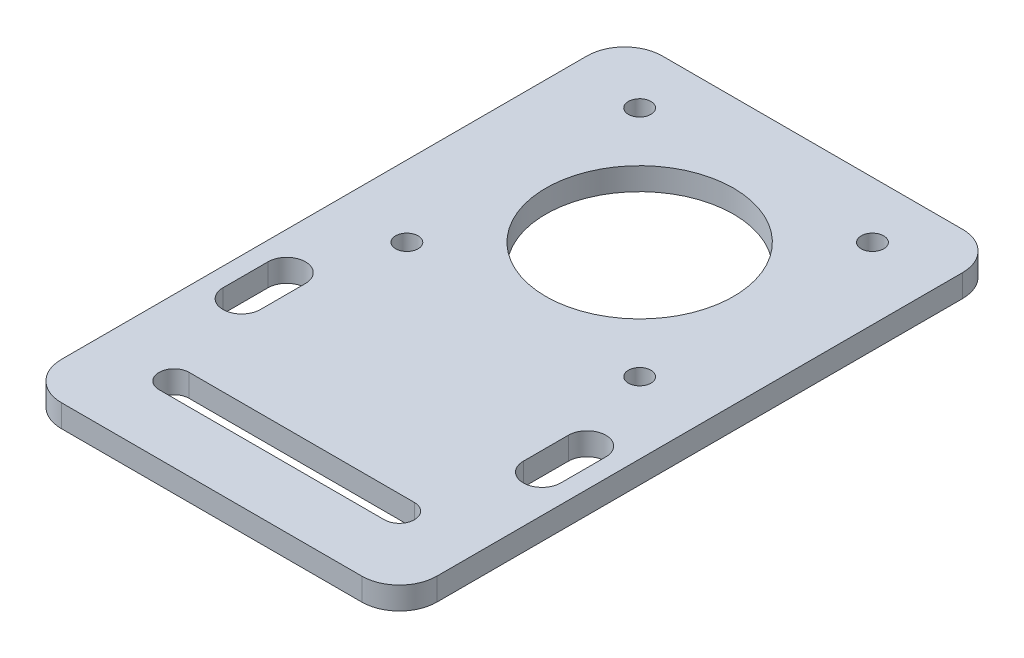
ISO-10303-21;
HEADER;
FILE_DESCRIPTION(('STEP AP214'),'2;1');
FILE_NAME('part.step','',(''),(''),'','','');
FILE_SCHEMA(('AUTOMOTIVE_DESIGN { 1 0 10303 214 1 1 1 1 }'));
ENDSEC;
DATA;
#1=APPLICATION_CONTEXT('core data for automotive mechanical design processes');
#2=APPLICATION_PROTOCOL_DEFINITION('international standard','automotive_design',2000,#1);
#3=PRODUCT_CONTEXT('',#1,'mechanical');
#4=PRODUCT('Part','Part','',(#3));
#5=PRODUCT_RELATED_PRODUCT_CATEGORY('part','',(#4));
#6=PRODUCT_DEFINITION_FORMATION('','',#4);
#7=PRODUCT_DEFINITION_CONTEXT('part definition',#1,'design');
#8=PRODUCT_DEFINITION('design','',#6,#7);
#9=PRODUCT_DEFINITION_SHAPE('','',#8);
#10=(LENGTH_UNIT() NAMED_UNIT(*) SI_UNIT(.MILLI.,.METRE.));
#11=(NAMED_UNIT(*) PLANE_ANGLE_UNIT() SI_UNIT($,.RADIAN.));
#12=(NAMED_UNIT(*) SI_UNIT($,.STERADIAN.) SOLID_ANGLE_UNIT());
#13=UNCERTAINTY_MEASURE_WITH_UNIT(LENGTH_MEASURE(1.E-05),#10,'distance_accuracy_value','');
#14=(GEOMETRIC_REPRESENTATION_CONTEXT(3) GLOBAL_UNCERTAINTY_ASSIGNED_CONTEXT((#13)) GLOBAL_UNIT_ASSIGNED_CONTEXT((#10,
#11,#12)) REPRESENTATION_CONTEXT('',''));
#15=CARTESIAN_POINT('',(0.,0.,0.));
#16=DIRECTION('',(0.,0.,1.));
#17=DIRECTION('',(1.,0.,0.));
#18=AXIS2_PLACEMENT_3D('',#15,#16,#17);
#19=CARTESIAN_POINT('',(-25.,3.,-40.));
#20=DIRECTION('',(1.,0.,0.));
#21=DIRECTION('',(0.,0.,-1.));
#22=AXIS2_PLACEMENT_3D('',#19,#20,#21);
#23=PLANE('',#22);
#24=DIRECTION('',(0.,0.,1.));
#25=VECTOR('',#24,1.);
#26=CARTESIAN_POINT('',(-25.,0.,-40.));
#27=LINE('',#26,#25);
#28=CARTESIAN_POINT('',(-25.,0.,-35.));
#29=VERTEX_POINT('',#28);
#30=CARTESIAN_POINT('',(-25.,0.,35.));
#31=VERTEX_POINT('',#30);
#32=EDGE_CURVE('E265',#29,#31,#27,.T.);
#33=ORIENTED_EDGE('',*,*,#32,.T.);
#34=DIRECTION('',(0.,-1.,0.));
#35=VECTOR('',#34,1.);
#36=CARTESIAN_POINT('',(-25.,3.,35.));
#37=LINE('',#36,#35);
#38=CARTESIAN_POINT('',(-25.,3.,35.));
#39=VERTEX_POINT('',#38);
#40=EDGE_CURVE('E352',#31,#39,#37,.F.);
#41=ORIENTED_EDGE('',*,*,#40,.T.);
#42=DIRECTION('',(0.,0.,1.));
#43=VECTOR('',#42,1.);
#44=CARTESIAN_POINT('',(-25.,3.,-40.));
#45=LINE('',#44,#43);
#46=CARTESIAN_POINT('',(-25.,3.,-35.));
#47=VERTEX_POINT('',#46);
#48=EDGE_CURVE('E300',#47,#39,#45,.T.);
#49=ORIENTED_EDGE('',*,*,#48,.F.);
#50=DIRECTION('',(0.,-1.,0.));
#51=VECTOR('',#50,1.);
#52=CARTESIAN_POINT('',(-25.,3.,-35.));
#53=LINE('',#52,#51);
#54=EDGE_CURVE('E349',#47,#29,#53,.T.);
#55=ORIENTED_EDGE('',*,*,#54,.T.);
#56=EDGE_LOOP('',(#33,#41,#49,#55));
#57=FACE_BOUND('',#56,.T.);
#58=ADVANCED_FACE('F32',(#57),#23,.F.);
#59=CARTESIAN_POINT('',(25.,3.,40.));
#60=DIRECTION('',(0.,0.,-1.));
#61=DIRECTION('',(-1.,0.,0.));
#62=AXIS2_PLACEMENT_3D('',#59,#60,#61);
#63=PLANE('',#62);
#64=DIRECTION('',(1.,0.,0.));
#65=VECTOR('',#64,1.);
#66=CARTESIAN_POINT('',(25.,0.,40.));
#67=LINE('',#66,#65);
#68=CARTESIAN_POINT('',(-20.,0.,40.));
#69=VERTEX_POINT('',#68);
#70=CARTESIAN_POINT('',(20.,0.,40.));
#71=VERTEX_POINT('',#70);
#72=EDGE_CURVE('E316',#69,#71,#67,.T.);
#73=ORIENTED_EDGE('',*,*,#72,.T.);
#74=DIRECTION('',(0.,-1.,0.));
#75=VECTOR('',#74,1.);
#76=CARTESIAN_POINT('',(20.,3.,40.));
#77=LINE('',#76,#75);
#78=CARTESIAN_POINT('',(20.,3.,40.));
#79=VERTEX_POINT('',#78);
#80=EDGE_CURVE('E339',#71,#79,#77,.F.);
#81=ORIENTED_EDGE('',*,*,#80,.T.);
#82=DIRECTION('',(1.,0.,0.));
#83=VECTOR('',#82,1.);
#84=CARTESIAN_POINT('',(25.,3.,40.));
#85=LINE('',#84,#83);
#86=CARTESIAN_POINT('',(-20.,3.,40.));
#87=VERTEX_POINT('',#86);
#88=EDGE_CURVE('E303',#87,#79,#85,.T.);
#89=ORIENTED_EDGE('',*,*,#88,.F.);
#90=DIRECTION('',(0.,-1.,0.));
#91=VECTOR('',#90,1.);
#92=CARTESIAN_POINT('',(-20.,3.,40.));
#93=LINE('',#92,#91);
#94=EDGE_CURVE('E336',#87,#69,#93,.T.);
#95=ORIENTED_EDGE('',*,*,#94,.T.);
#96=EDGE_LOOP('',(#73,#81,#89,#95));
#97=FACE_BOUND('',#96,.T.);
#98=ADVANCED_FACE('F381',(#97),#63,.F.);
#99=CARTESIAN_POINT('',(25.,3.,-40.));
#100=DIRECTION('',(-1.,0.,0.));
#101=DIRECTION('',(0.,0.,1.));
#102=AXIS2_PLACEMENT_3D('',#99,#100,#101);
#103=PLANE('',#102);
#104=DIRECTION('',(0.,0.,-1.));
#105=VECTOR('',#104,1.);
#106=CARTESIAN_POINT('',(25.,3.,-40.));
#107=LINE('',#106,#105);
#108=CARTESIAN_POINT('',(25.,3.,35.));
#109=VERTEX_POINT('',#108);
#110=CARTESIAN_POINT('',(25.,3.,-35.));
#111=VERTEX_POINT('',#110);
#112=EDGE_CURVE('E307',#109,#111,#107,.T.);
#113=ORIENTED_EDGE('',*,*,#112,.F.);
#114=DIRECTION('',(0.,-1.,0.));
#115=VECTOR('',#114,1.);
#116=CARTESIAN_POINT('',(25.,3.,35.));
#117=LINE('',#116,#115);
#118=CARTESIAN_POINT('',(25.,0.,35.));
#119=VERTEX_POINT('',#118);
#120=EDGE_CURVE('E325',#109,#119,#117,.T.);
#121=ORIENTED_EDGE('',*,*,#120,.T.);
#122=DIRECTION('',(0.,0.,-1.));
#123=VECTOR('',#122,1.);
#124=CARTESIAN_POINT('',(25.,0.,-40.));
#125=LINE('',#124,#123);
#126=CARTESIAN_POINT('',(25.,0.,-35.));
#127=VERTEX_POINT('',#126);
#128=EDGE_CURVE('E319',#119,#127,#125,.T.);
#129=ORIENTED_EDGE('',*,*,#128,.T.);
#130=DIRECTION('',(0.,-1.,0.));
#131=VECTOR('',#130,1.);
#132=CARTESIAN_POINT('',(25.,3.,-35.));
#133=LINE('',#132,#131);
#134=EDGE_CURVE('E313',#127,#111,#133,.F.);
#135=ORIENTED_EDGE('',*,*,#134,.T.);
#136=EDGE_LOOP('',(#113,#121,#129,#135));
#137=FACE_BOUND('',#136,.T.);
#138=ADVANCED_FACE('F389',(#137),#103,.F.);
#139=CARTESIAN_POINT('',(25.,3.,-40.));
#140=DIRECTION('',(0.,0.,1.));
#141=DIRECTION('',(1.,0.,0.));
#142=AXIS2_PLACEMENT_3D('',#139,#140,#141);
#143=PLANE('',#142);
#144=DIRECTION('',(-1.,0.,0.));
#145=VECTOR('',#144,1.);
#146=CARTESIAN_POINT('',(25.,0.,-40.));
#147=LINE('',#146,#145);
#148=CARTESIAN_POINT('',(20.,0.,-40.));
#149=VERTEX_POINT('',#148);
#150=CARTESIAN_POINT('',(-20.,0.,-40.));
#151=VERTEX_POINT('',#150);
#152=EDGE_CURVE('E304',#149,#151,#147,.T.);
#153=ORIENTED_EDGE('',*,*,#152,.T.);
#154=DIRECTION('',(0.,-1.,0.));
#155=VECTOR('',#154,1.);
#156=CARTESIAN_POINT('',(-20.,3.,-40.));
#157=LINE('',#156,#155);
#158=CARTESIAN_POINT('',(-20.,3.,-40.));
#159=VERTEX_POINT('',#158);
#160=EDGE_CURVE('E11',#151,#159,#157,.F.);
#161=ORIENTED_EDGE('',*,*,#160,.T.);
#162=DIRECTION('',(-1.,0.,0.));
#163=VECTOR('',#162,1.);
#164=CARTESIAN_POINT('',(25.,3.,-40.));
#165=LINE('',#164,#163);
#166=CARTESIAN_POINT('',(20.,3.,-40.));
#167=VERTEX_POINT('',#166);
#168=EDGE_CURVE('E310',#167,#159,#165,.T.);
#169=ORIENTED_EDGE('',*,*,#168,.F.);
#170=DIRECTION('',(0.,-1.,0.));
#171=VECTOR('',#170,1.);
#172=CARTESIAN_POINT('',(20.,3.,-40.));
#173=LINE('',#172,#171);
#174=EDGE_CURVE('E40',#167,#149,#173,.T.);
#175=ORIENTED_EDGE('',*,*,#174,.T.);
#176=EDGE_LOOP('',(#153,#161,#169,#175));
#177=FACE_BOUND('',#176,.T.);
#178=ADVANCED_FACE('F358',(#177),#143,.F.);
#179=CARTESIAN_POINT('',(0.,3.,0.));
#180=DIRECTION('',(0.,-1.,0.));
#181=DIRECTION('',(0.,0.,-1.));
#182=AXIS2_PLACEMENT_3D('',#179,#180,#181);
#183=PLANE('',#182);
#184=DIRECTION('',(0.,0.,1.));
#185=VECTOR('',#184,1.);
#186=CARTESIAN_POINT('',(17.4999999999999,3.,10.));
#187=LINE('',#186,#185);
#188=CARTESIAN_POINT('',(17.4999999999999,3.,10.));
#189=VERTEX_POINT('',#188);
#190=CARTESIAN_POINT('',(17.4999999999999,3.,16.));
#191=VERTEX_POINT('',#190);
#192=EDGE_CURVE('E198',#189,#191,#187,.T.);
#193=ORIENTED_EDGE('',*,*,#192,.F.);
#194=CARTESIAN_POINT('',(20.,3.,10.));
#195=DIRECTION('',(0.,1.,0.));
#196=DIRECTION('',(0.,0.,1.));
#197=AXIS2_PLACEMENT_3D('',#194,#195,#196);
#198=CIRCLE('',#197,2.50000000000007);
#199=CARTESIAN_POINT('',(22.5,3.,10.));
#200=VERTEX_POINT('',#199);
#201=EDGE_CURVE('E47',#200,#189,#198,.T.);
#202=ORIENTED_EDGE('',*,*,#201,.F.);
#203=DIRECTION('',(0.,0.,-1.));
#204=VECTOR('',#203,1.);
#205=CARTESIAN_POINT('',(22.5,3.,10.));
#206=LINE('',#205,#204);
#207=CARTESIAN_POINT('',(22.5,3.,16.));
#208=VERTEX_POINT('',#207);
#209=EDGE_CURVE('E189',#208,#200,#206,.T.);
#210=ORIENTED_EDGE('',*,*,#209,.F.);
#211=CARTESIAN_POINT('',(20.,3.,16.));
#212=DIRECTION('',(0.,1.,0.));
#213=DIRECTION('',(0.,0.,1.));
#214=AXIS2_PLACEMENT_3D('',#211,#212,#213);
#215=CIRCLE('',#214,2.50000000000007);
#216=EDGE_CURVE('E192',#191,#208,#215,.T.);
#217=ORIENTED_EDGE('',*,*,#216,.F.);
#218=EDGE_LOOP('',(#193,#202,#210,#217));
#219=FACE_BOUND('',#218,.T.);
#220=DIRECTION('',(0.,0.,1.));
#221=VECTOR('',#220,1.);
#222=CARTESIAN_POINT('',(-22.5,3.,10.0000000000002));
#223=LINE('',#222,#221);
#224=CARTESIAN_POINT('',(-22.5,3.,10.0000000000002));
#225=VERTEX_POINT('',#224);
#226=CARTESIAN_POINT('',(-22.4999999999999,3.,16.0000000000002));
#227=VERTEX_POINT('',#226);
#228=EDGE_CURVE('E224',#225,#227,#223,.T.);
#229=ORIENTED_EDGE('',*,*,#228,.F.);
#230=CARTESIAN_POINT('',(-19.9999999999999,3.,10.0000000000002));
#231=DIRECTION('',(0.,1.,0.));
#232=DIRECTION('',(0.,0.,-1.));
#233=AXIS2_PLACEMENT_3D('',#230,#231,#232);
#234=CIRCLE('',#233,2.50000000000007);
#235=CARTESIAN_POINT('',(-17.4999999999998,3.,10.0000000000002));
#236=VERTEX_POINT('',#235);
#237=EDGE_CURVE('E55',#236,#225,#234,.T.);
#238=ORIENTED_EDGE('',*,*,#237,.F.);
#239=DIRECTION('',(0.,0.,-1.));
#240=VECTOR('',#239,1.);
#241=CARTESIAN_POINT('',(-17.4999999999998,3.,10.0000000000002));
#242=LINE('',#241,#240);
#243=CARTESIAN_POINT('',(-17.4999999999998,3.,16.0000000000002));
#244=VERTEX_POINT('',#243);
#245=EDGE_CURVE('E213',#244,#236,#242,.T.);
#246=ORIENTED_EDGE('',*,*,#245,.F.);
#247=CARTESIAN_POINT('',(-19.9999999999999,3.,16.0000000000002));
#248=DIRECTION('',(0.,1.,0.));
#249=DIRECTION('',(0.,0.,-1.));
#250=AXIS2_PLACEMENT_3D('',#247,#248,#249);
#251=CIRCLE('',#250,2.50000000000007);
#252=EDGE_CURVE('E227',#227,#244,#251,.T.);
#253=ORIENTED_EDGE('',*,*,#252,.F.);
#254=EDGE_LOOP('',(#229,#238,#246,#253));
#255=FACE_BOUND('',#254,.T.);
#256=DIRECTION('',(1.,0.,0.));
#257=VECTOR('',#256,1.);
#258=CARTESIAN_POINT('',(-15.0000000000099,3.,32.));
#259=LINE('',#258,#257);
#260=CARTESIAN_POINT('',(-15.0000000000099,3.,32.));
#261=VERTEX_POINT('',#260);
#262=CARTESIAN_POINT('',(15.0000000000099,3.,32.));
#263=VERTEX_POINT('',#262);
#264=EDGE_CURVE('E254',#261,#263,#259,.T.);
#265=ORIENTED_EDGE('',*,*,#264,.F.);
#266=CARTESIAN_POINT('',(-15.0000000000099,3.,30.));
#267=DIRECTION('',(0.,1.,0.));
#268=DIRECTION('',(0.,0.,1.));
#269=AXIS2_PLACEMENT_3D('',#266,#267,#268);
#270=CIRCLE('',#269,2.);
#271=CARTESIAN_POINT('',(-15.0000000000099,3.,28.));
#272=VERTEX_POINT('',#271);
#273=EDGE_CURVE('E252',#272,#261,#270,.T.);
#274=ORIENTED_EDGE('',*,*,#273,.F.);
#275=DIRECTION('',(-1.,0.,0.));
#276=VECTOR('',#275,1.);
#277=CARTESIAN_POINT('',(-15.0000000000099,3.,28.));
#278=LINE('',#277,#276);
#279=CARTESIAN_POINT('',(15.,3.,28.));
#280=VERTEX_POINT('',#279);
#281=EDGE_CURVE('E242',#280,#272,#278,.T.);
#282=ORIENTED_EDGE('',*,*,#281,.F.);
#283=CARTESIAN_POINT('',(15.0000000000099,3.,30.));
#284=DIRECTION('',(0.,1.,0.));
#285=DIRECTION('',(0.,0.,1.));
#286=AXIS2_PLACEMENT_3D('',#283,#284,#285);
#287=CIRCLE('',#286,2.00000000000001);
#288=EDGE_CURVE('E258',#263,#280,#287,.T.);
#289=ORIENTED_EDGE('',*,*,#288,.F.);
#290=EDGE_LOOP('',(#265,#274,#282,#289));
#291=FACE_BOUND('',#290,.T.);
#292=CARTESIAN_POINT('',(0.,3.,-17.));
#293=DIRECTION('',(0.,1.,0.));
#294=DIRECTION('',(0.,0.,1.));
#295=AXIS2_PLACEMENT_3D('',#292,#293,#294);
#296=CIRCLE('',#295,12.5);
#297=CARTESIAN_POINT('',(0.,3.,-4.5));
#298=VERTEX_POINT('',#297);
#299=EDGE_CURVE('E205',#298,#298,#296,.T.);
#300=ORIENTED_EDGE('',*,*,#299,.F.);
#301=EDGE_LOOP('',(#300));
#302=FACE_BOUND('',#301,.T.);
#303=CARTESIAN_POINT('',(15.5,3.,-1.5));
#304=DIRECTION('',(0.,1.,0.));
#305=DIRECTION('',(0.,0.,1.));
#306=AXIS2_PLACEMENT_3D('',#303,#304,#305);
#307=CIRCLE('',#306,1.5);
#308=CARTESIAN_POINT('',(15.5,3.,0.));
#309=VERTEX_POINT('',#308);
#310=EDGE_CURVE('E275',#309,#309,#307,.T.);
#311=ORIENTED_EDGE('',*,*,#310,.F.);
#312=EDGE_LOOP('',(#311));
#313=FACE_BOUND('',#312,.T.);
#314=CARTESIAN_POINT('',(15.5,3.,-32.5));
#315=DIRECTION('',(0.,1.,0.));
#316=DIRECTION('',(0.,0.,1.));
#317=AXIS2_PLACEMENT_3D('',#314,#315,#316);
#318=CIRCLE('',#317,1.5);
#319=CARTESIAN_POINT('',(15.5,3.,-31.));
#320=VERTEX_POINT('',#319);
#321=EDGE_CURVE('E292',#320,#320,#318,.T.);
#322=ORIENTED_EDGE('',*,*,#321,.F.);
#323=EDGE_LOOP('',(#322));
#324=FACE_BOUND('',#323,.T.);
#325=CARTESIAN_POINT('',(-15.5,3.,-1.5));
#326=DIRECTION('',(0.,1.,0.));
#327=DIRECTION('',(0.,0.,1.));
#328=AXIS2_PLACEMENT_3D('',#325,#326,#327);
#329=CIRCLE('',#328,1.5);
#330=CARTESIAN_POINT('',(-15.5,3.,0.));
#331=VERTEX_POINT('',#330);
#332=EDGE_CURVE('E286',#331,#331,#329,.T.);
#333=ORIENTED_EDGE('',*,*,#332,.F.);
#334=EDGE_LOOP('',(#333));
#335=FACE_BOUND('',#334,.T.);
#336=CARTESIAN_POINT('',(-15.5,3.,-32.5));
#337=DIRECTION('',(0.,1.,0.));
#338=DIRECTION('',(0.,0.,1.));
#339=AXIS2_PLACEMENT_3D('',#336,#337,#338);
#340=CIRCLE('',#339,1.5);
#341=CARTESIAN_POINT('',(-15.5,3.,-31.));
#342=VERTEX_POINT('',#341);
#343=EDGE_CURVE('E280',#342,#342,#340,.T.);
#344=ORIENTED_EDGE('',*,*,#343,.F.);
#345=EDGE_LOOP('',(#344));
#346=FACE_BOUND('',#345,.T.);
#347=ORIENTED_EDGE('',*,*,#88,.T.);
#348=CARTESIAN_POINT('',(20.,3.,35.));
#349=DIRECTION('',(0.,-1.,0.));
#350=DIRECTION('',(0.,0.,-1.));
#351=AXIS2_PLACEMENT_3D('',#348,#349,#350);
#352=CIRCLE('',#351,5.);
#353=EDGE_CURVE('E347',#79,#109,#352,.F.);
#354=ORIENTED_EDGE('',*,*,#353,.T.);
#355=ORIENTED_EDGE('',*,*,#112,.T.);
#356=CARTESIAN_POINT('',(20.,3.,-35.));
#357=DIRECTION('',(0.,-1.,0.));
#358=DIRECTION('',(0.,0.,-1.));
#359=AXIS2_PLACEMENT_3D('',#356,#357,#358);
#360=CIRCLE('',#359,5.);
#361=EDGE_CURVE('E341',#111,#167,#360,.F.);
#362=ORIENTED_EDGE('',*,*,#361,.T.);
#363=ORIENTED_EDGE('',*,*,#168,.T.);
#364=CARTESIAN_POINT('',(-20.,3.,-35.));
#365=DIRECTION('',(0.,-1.,0.));
#366=DIRECTION('',(0.,0.,-1.));
#367=AXIS2_PLACEMENT_3D('',#364,#365,#366);
#368=CIRCLE('',#367,5.);
#369=EDGE_CURVE('E343',#159,#47,#368,.F.);
#370=ORIENTED_EDGE('',*,*,#369,.T.);
#371=ORIENTED_EDGE('',*,*,#48,.T.);
#372=CARTESIAN_POINT('',(-20.,3.,35.));
#373=DIRECTION('',(0.,-1.,0.));
#374=DIRECTION('',(0.,0.,-1.));
#375=AXIS2_PLACEMENT_3D('',#372,#373,#374);
#376=CIRCLE('',#375,5.);
#377=EDGE_CURVE('E345',#39,#87,#376,.F.);
#378=ORIENTED_EDGE('',*,*,#377,.T.);
#379=EDGE_LOOP('',(#347,#354,#355,#362,#363,#370,#371,#378));
#380=FACE_BOUND('',#379,.T.);
#381=ADVANCED_FACE('F374',(#219,#255,#291,#302,#313,#324,#335,#346,#380),#183,.F.);
#382=CARTESIAN_POINT('',(0.,0.,0.));
#383=DIRECTION('',(0.,-1.,0.));
#384=DIRECTION('',(0.,0.,-1.));
#385=AXIS2_PLACEMENT_3D('',#382,#383,#384);
#386=PLANE('',#385);
#387=CARTESIAN_POINT('',(20.,0.,10.));
#388=DIRECTION('',(0.,1.,0.));
#389=DIRECTION('',(0.,0.,1.));
#390=AXIS2_PLACEMENT_3D('',#387,#388,#389);
#391=CIRCLE('',#390,2.50000000000007);
#392=CARTESIAN_POINT('',(22.5,0.,10.));
#393=VERTEX_POINT('',#392);
#394=CARTESIAN_POINT('',(17.4999999999999,0.,10.));
#395=VERTEX_POINT('',#394);
#396=EDGE_CURVE('E170',#393,#395,#391,.T.);
#397=ORIENTED_EDGE('',*,*,#396,.T.);
#398=DIRECTION('',(0.,0.,1.));
#399=VECTOR('',#398,1.);
#400=CARTESIAN_POINT('',(17.4999999999999,0.,10.));
#401=LINE('',#400,#399);
#402=CARTESIAN_POINT('',(17.4999999999999,0.,16.));
#403=VERTEX_POINT('',#402);
#404=EDGE_CURVE('E180',#395,#403,#401,.T.);
#405=ORIENTED_EDGE('',*,*,#404,.T.);
#406=CARTESIAN_POINT('',(20.,0.,16.));
#407=DIRECTION('',(0.,1.,0.));
#408=DIRECTION('',(0.,0.,1.));
#409=AXIS2_PLACEMENT_3D('',#406,#407,#408);
#410=CIRCLE('',#409,2.50000000000007);
#411=CARTESIAN_POINT('',(22.5,0.,16.));
#412=VERTEX_POINT('',#411);
#413=EDGE_CURVE('E184',#403,#412,#410,.T.);
#414=ORIENTED_EDGE('',*,*,#413,.T.);
#415=DIRECTION('',(0.,0.,-1.));
#416=VECTOR('',#415,1.);
#417=CARTESIAN_POINT('',(22.5,0.,10.));
#418=LINE('',#417,#416);
#419=EDGE_CURVE('E176',#412,#393,#418,.T.);
#420=ORIENTED_EDGE('',*,*,#419,.T.);
#421=EDGE_LOOP('',(#397,#405,#414,#420));
#422=FACE_BOUND('',#421,.T.);
#423=CARTESIAN_POINT('',(-19.9999999999999,0.,10.0000000000002));
#424=DIRECTION('',(0.,1.,0.));
#425=DIRECTION('',(0.,0.,-1.));
#426=AXIS2_PLACEMENT_3D('',#423,#424,#425);
#427=CIRCLE('',#426,2.50000000000007);
#428=CARTESIAN_POINT('',(-17.4999999999998,0.,10.0000000000002));
#429=VERTEX_POINT('',#428);
#430=CARTESIAN_POINT('',(-22.5,0.,10.0000000000002));
#431=VERTEX_POINT('',#430);
#432=EDGE_CURVE('E209',#429,#431,#427,.T.);
#433=ORIENTED_EDGE('',*,*,#432,.T.);
#434=DIRECTION('',(0.,0.,1.));
#435=VECTOR('',#434,1.);
#436=CARTESIAN_POINT('',(-22.5,0.,10.0000000000002));
#437=LINE('',#436,#435);
#438=CARTESIAN_POINT('',(-22.4999999999999,0.,16.0000000000002));
#439=VERTEX_POINT('',#438);
#440=EDGE_CURVE('E212',#431,#439,#437,.T.);
#441=ORIENTED_EDGE('',*,*,#440,.T.);
#442=CARTESIAN_POINT('',(-19.9999999999999,0.,16.0000000000002));
#443=DIRECTION('',(0.,1.,0.));
#444=DIRECTION('',(0.,0.,-1.));
#445=AXIS2_PLACEMENT_3D('',#442,#443,#444);
#446=CIRCLE('',#445,2.50000000000007);
#447=CARTESIAN_POINT('',(-17.4999999999998,0.,16.0000000000002));
#448=VERTEX_POINT('',#447);
#449=EDGE_CURVE('E216',#439,#448,#446,.T.);
#450=ORIENTED_EDGE('',*,*,#449,.T.);
#451=DIRECTION('',(0.,0.,-1.));
#452=VECTOR('',#451,1.);
#453=CARTESIAN_POINT('',(-17.4999999999998,0.,10.0000000000002));
#454=LINE('',#453,#452);
#455=EDGE_CURVE('E219',#448,#429,#454,.T.);
#456=ORIENTED_EDGE('',*,*,#455,.T.);
#457=EDGE_LOOP('',(#433,#441,#450,#456));
#458=FACE_BOUND('',#457,.T.);
#459=CARTESIAN_POINT('',(-15.0000000000099,0.,30.));
#460=DIRECTION('',(0.,1.,0.));
#461=DIRECTION('',(0.,0.,1.));
#462=AXIS2_PLACEMENT_3D('',#459,#460,#461);
#463=CIRCLE('',#462,2.);
#464=CARTESIAN_POINT('',(-15.0000000000099,0.,28.));
#465=VERTEX_POINT('',#464);
#466=CARTESIAN_POINT('',(-15.0000000000099,0.,32.));
#467=VERTEX_POINT('',#466);
#468=EDGE_CURVE('E238',#465,#467,#463,.T.);
#469=ORIENTED_EDGE('',*,*,#468,.T.);
#470=DIRECTION('',(1.,0.,0.));
#471=VECTOR('',#470,1.);
#472=CARTESIAN_POINT('',(-15.0000000000099,0.,32.));
#473=LINE('',#472,#471);
#474=CARTESIAN_POINT('',(15.0000000000099,0.,32.));
#475=VERTEX_POINT('',#474);
#476=EDGE_CURVE('E241',#467,#475,#473,.T.);
#477=ORIENTED_EDGE('',*,*,#476,.T.);
#478=CARTESIAN_POINT('',(15.0000000000099,0.,30.));
#479=DIRECTION('',(0.,1.,0.));
#480=DIRECTION('',(0.,0.,1.));
#481=AXIS2_PLACEMENT_3D('',#478,#479,#480);
#482=CIRCLE('',#481,2.00000000000001);
#483=CARTESIAN_POINT('',(15.,0.,28.));
#484=VERTEX_POINT('',#483);
#485=EDGE_CURVE('E245',#475,#484,#482,.T.);
#486=ORIENTED_EDGE('',*,*,#485,.T.);
#487=DIRECTION('',(-1.,0.,0.));
#488=VECTOR('',#487,1.);
#489=CARTESIAN_POINT('',(-15.0000000000099,0.,28.));
#490=LINE('',#489,#488);
#491=EDGE_CURVE('E248',#484,#465,#490,.T.);
#492=ORIENTED_EDGE('',*,*,#491,.T.);
#493=EDGE_LOOP('',(#469,#477,#486,#492));
#494=FACE_BOUND('',#493,.T.);
#495=CARTESIAN_POINT('',(0.,0.,-17.));
#496=DIRECTION('',(0.,1.,0.));
#497=DIRECTION('',(0.,0.,1.));
#498=AXIS2_PLACEMENT_3D('',#495,#496,#497);
#499=CIRCLE('',#498,12.5);
#500=CARTESIAN_POINT('',(0.,0.,-4.5));
#501=VERTEX_POINT('',#500);
#502=EDGE_CURVE('E272',#501,#501,#499,.T.);
#503=ORIENTED_EDGE('',*,*,#502,.T.);
#504=EDGE_LOOP('',(#503));
#505=FACE_BOUND('',#504,.T.);
#506=CARTESIAN_POINT('',(15.5,0.,-1.5));
#507=DIRECTION('',(0.,1.,0.));
#508=DIRECTION('',(0.,0.,1.));
#509=AXIS2_PLACEMENT_3D('',#506,#507,#508);
#510=CIRCLE('',#509,1.5);
#511=CARTESIAN_POINT('',(15.5,0.,0.));
#512=VERTEX_POINT('',#511);
#513=EDGE_CURVE('E295',#512,#512,#510,.T.);
#514=ORIENTED_EDGE('',*,*,#513,.T.);
#515=EDGE_LOOP('',(#514));
#516=FACE_BOUND('',#515,.T.);
#517=CARTESIAN_POINT('',(15.5,0.,-32.5));
#518=DIRECTION('',(0.,1.,0.));
#519=DIRECTION('',(0.,0.,1.));
#520=AXIS2_PLACEMENT_3D('',#517,#518,#519);
#521=CIRCLE('',#520,1.5);
#522=CARTESIAN_POINT('',(15.5,0.,-31.));
#523=VERTEX_POINT('',#522);
#524=EDGE_CURVE('E289',#523,#523,#521,.T.);
#525=ORIENTED_EDGE('',*,*,#524,.T.);
#526=EDGE_LOOP('',(#525));
#527=FACE_BOUND('',#526,.T.);
#528=CARTESIAN_POINT('',(-15.5,0.,-1.5));
#529=DIRECTION('',(0.,1.,0.));
#530=DIRECTION('',(0.,0.,1.));
#531=AXIS2_PLACEMENT_3D('',#528,#529,#530);
#532=CIRCLE('',#531,1.5);
#533=CARTESIAN_POINT('',(-15.5,0.,0.));
#534=VERTEX_POINT('',#533);
#535=EDGE_CURVE('E283',#534,#534,#532,.T.);
#536=ORIENTED_EDGE('',*,*,#535,.T.);
#537=EDGE_LOOP('',(#536));
#538=FACE_BOUND('',#537,.T.);
#539=CARTESIAN_POINT('',(-15.5,0.,-32.5));
#540=DIRECTION('',(0.,1.,0.));
#541=DIRECTION('',(0.,0.,1.));
#542=AXIS2_PLACEMENT_3D('',#539,#540,#541);
#543=CIRCLE('',#542,1.5);
#544=CARTESIAN_POINT('',(-15.5,0.,-31.));
#545=VERTEX_POINT('',#544);
#546=EDGE_CURVE('E255',#545,#545,#543,.T.);
#547=ORIENTED_EDGE('',*,*,#546,.T.);
#548=EDGE_LOOP('',(#547));
#549=FACE_BOUND('',#548,.T.);
#550=ORIENTED_EDGE('',*,*,#128,.F.);
#551=CARTESIAN_POINT('',(20.,0.,35.));
#552=DIRECTION('',(0.,-1.,0.));
#553=DIRECTION('',(0.,0.,-1.));
#554=AXIS2_PLACEMENT_3D('',#551,#552,#553);
#555=CIRCLE('',#554,5.);
#556=EDGE_CURVE('E334',#119,#71,#555,.T.);
#557=ORIENTED_EDGE('',*,*,#556,.T.);
#558=ORIENTED_EDGE('',*,*,#72,.F.);
#559=CARTESIAN_POINT('',(-20.,0.,35.));
#560=DIRECTION('',(0.,-1.,0.));
#561=DIRECTION('',(0.,0.,-1.));
#562=AXIS2_PLACEMENT_3D('',#559,#560,#561);
#563=CIRCLE('',#562,5.);
#564=EDGE_CURVE('E332',#69,#31,#563,.T.);
#565=ORIENTED_EDGE('',*,*,#564,.T.);
#566=ORIENTED_EDGE('',*,*,#32,.F.);
#567=CARTESIAN_POINT('',(-20.,0.,-35.));
#568=DIRECTION('',(0.,-1.,0.));
#569=DIRECTION('',(0.,0.,-1.));
#570=AXIS2_PLACEMENT_3D('',#567,#568,#569);
#571=CIRCLE('',#570,5.);
#572=EDGE_CURVE('E330',#29,#151,#571,.T.);
#573=ORIENTED_EDGE('',*,*,#572,.T.);
#574=ORIENTED_EDGE('',*,*,#152,.F.);
#575=CARTESIAN_POINT('',(20.,0.,-35.));
#576=DIRECTION('',(0.,-1.,0.));
#577=DIRECTION('',(0.,0.,-1.));
#578=AXIS2_PLACEMENT_3D('',#575,#576,#577);
#579=CIRCLE('',#578,5.);
#580=EDGE_CURVE('E328',#149,#127,#579,.T.);
#581=ORIENTED_EDGE('',*,*,#580,.T.);
#582=EDGE_LOOP('',(#550,#557,#558,#565,#566,#573,#574,#581));
#583=FACE_BOUND('',#582,.T.);
#584=ADVANCED_FACE('F186',(#422,#458,#494,#505,#516,#527,#538,#549,#583),#386,.T.);
#585=CARTESIAN_POINT('',(-15.5,0.,-32.5));
#586=DIRECTION('',(0.,1.,0.));
#587=DIRECTION('',(0.,0.,1.));
#588=AXIS2_PLACEMENT_3D('',#585,#586,#587);
#589=CYLINDRICAL_SURFACE('',#588,1.5);
#590=ORIENTED_EDGE('',*,*,#546,.F.);
#591=EDGE_LOOP('',(#590));
#592=FACE_BOUND('',#591,.T.);
#593=ORIENTED_EDGE('',*,*,#343,.T.);
#594=EDGE_LOOP('',(#593));
#595=FACE_BOUND('',#594,.T.);
#596=ADVANCED_FACE('F445',(#592,#595),#589,.F.);
#597=CARTESIAN_POINT('',(-15.5,0.,-1.5));
#598=DIRECTION('',(0.,1.,0.));
#599=DIRECTION('',(0.,0.,1.));
#600=AXIS2_PLACEMENT_3D('',#597,#598,#599);
#601=CYLINDRICAL_SURFACE('',#600,1.5);
#602=ORIENTED_EDGE('',*,*,#535,.F.);
#603=EDGE_LOOP('',(#602));
#604=FACE_BOUND('',#603,.T.);
#605=ORIENTED_EDGE('',*,*,#332,.T.);
#606=EDGE_LOOP('',(#605));
#607=FACE_BOUND('',#606,.T.);
#608=ADVANCED_FACE('F542',(#604,#607),#601,.F.);
#609=CARTESIAN_POINT('',(15.5,0.,-32.5));
#610=DIRECTION('',(0.,1.,0.));
#611=DIRECTION('',(0.,0.,1.));
#612=AXIS2_PLACEMENT_3D('',#609,#610,#611);
#613=CYLINDRICAL_SURFACE('',#612,1.5);
#614=ORIENTED_EDGE('',*,*,#524,.F.);
#615=EDGE_LOOP('',(#614));
#616=FACE_BOUND('',#615,.T.);
#617=ORIENTED_EDGE('',*,*,#321,.T.);
#618=EDGE_LOOP('',(#617));
#619=FACE_BOUND('',#618,.T.);
#620=ADVANCED_FACE('F546',(#616,#619),#613,.F.);
#621=CARTESIAN_POINT('',(15.5,0.,-1.5));
#622=DIRECTION('',(0.,1.,0.));
#623=DIRECTION('',(0.,0.,1.));
#624=AXIS2_PLACEMENT_3D('',#621,#622,#623);
#625=CYLINDRICAL_SURFACE('',#624,1.5);
#626=ORIENTED_EDGE('',*,*,#513,.F.);
#627=EDGE_LOOP('',(#626));
#628=FACE_BOUND('',#627,.T.);
#629=ORIENTED_EDGE('',*,*,#310,.T.);
#630=EDGE_LOOP('',(#629));
#631=FACE_BOUND('',#630,.T.);
#632=ADVANCED_FACE('F539',(#628,#631),#625,.F.);
#633=CARTESIAN_POINT('',(0.,0.,-17.));
#634=DIRECTION('',(0.,1.,0.));
#635=DIRECTION('',(0.,0.,1.));
#636=AXIS2_PLACEMENT_3D('',#633,#634,#635);
#637=CYLINDRICAL_SURFACE('',#636,12.5);
#638=ORIENTED_EDGE('',*,*,#502,.F.);
#639=EDGE_LOOP('',(#638));
#640=FACE_BOUND('',#639,.T.);
#641=ORIENTED_EDGE('',*,*,#299,.T.);
#642=EDGE_LOOP('',(#641));
#643=FACE_BOUND('',#642,.T.);
#644=ADVANCED_FACE('F535',(#640,#643),#637,.F.);
#645=CARTESIAN_POINT('',(-15.0000000000099,0.,30.));
#646=DIRECTION('',(0.,1.,0.));
#647=DIRECTION('',(0.,0.,1.));
#648=AXIS2_PLACEMENT_3D('',#645,#646,#647);
#649=CYLINDRICAL_SURFACE('',#648,2.);
#650=ORIENTED_EDGE('',*,*,#273,.T.);
#651=DIRECTION('',(0.,1.,0.));
#652=VECTOR('',#651,1.);
#653=CARTESIAN_POINT('',(-15.0000000000099,0.,32.));
#654=LINE('',#653,#652);
#655=EDGE_CURVE('E251',#467,#261,#654,.T.);
#656=ORIENTED_EDGE('',*,*,#655,.F.);
#657=ORIENTED_EDGE('',*,*,#468,.F.);
#658=DIRECTION('',(0.,1.,0.));
#659=VECTOR('',#658,1.);
#660=CARTESIAN_POINT('',(-15.0000000000099,0.,28.));
#661=LINE('',#660,#659);
#662=EDGE_CURVE('E263',#465,#272,#661,.T.);
#663=ORIENTED_EDGE('',*,*,#662,.T.);
#664=EDGE_LOOP('',(#650,#656,#657,#663));
#665=FACE_BOUND('',#664,.T.);
#666=ADVANCED_FACE('F526',(#665),#649,.F.);
#667=CARTESIAN_POINT('',(-15.0000000000099,0.,28.));
#668=DIRECTION('',(0.,0.,-1.));
#669=DIRECTION('',(-1.,0.,0.));
#670=AXIS2_PLACEMENT_3D('',#667,#668,#669);
#671=PLANE('',#670);
#672=ORIENTED_EDGE('',*,*,#281,.T.);
#673=ORIENTED_EDGE('',*,*,#662,.F.);
#674=ORIENTED_EDGE('',*,*,#491,.F.);
#675=DIRECTION('',(0.,1.,0.));
#676=VECTOR('',#675,1.);
#677=CARTESIAN_POINT('',(15.,0.,28.));
#678=LINE('',#677,#676);
#679=EDGE_CURVE('E266',#484,#280,#678,.T.);
#680=ORIENTED_EDGE('',*,*,#679,.T.);
#681=EDGE_LOOP('',(#672,#673,#674,#680));
#682=FACE_BOUND('',#681,.T.);
#683=ADVANCED_FACE('F522',(#682),#671,.F.);
#684=CARTESIAN_POINT('',(15.0000000000099,0.,30.));
#685=DIRECTION('',(0.,1.,0.));
#686=DIRECTION('',(0.,0.,1.));
#687=AXIS2_PLACEMENT_3D('',#684,#685,#686);
#688=CYLINDRICAL_SURFACE('',#687,2.00000000000001);
#689=ORIENTED_EDGE('',*,*,#288,.T.);
#690=ORIENTED_EDGE('',*,*,#679,.F.);
#691=ORIENTED_EDGE('',*,*,#485,.F.);
#692=DIRECTION('',(0.,1.,0.));
#693=VECTOR('',#692,1.);
#694=CARTESIAN_POINT('',(15.0000000000099,0.,32.));
#695=LINE('',#694,#693);
#696=EDGE_CURVE('E268',#475,#263,#695,.T.);
#697=ORIENTED_EDGE('',*,*,#696,.T.);
#698=EDGE_LOOP('',(#689,#690,#691,#697));
#699=FACE_BOUND('',#698,.T.);
#700=ADVANCED_FACE('F525',(#699),#688,.F.);
#701=CARTESIAN_POINT('',(-15.0000000000099,0.,32.));
#702=DIRECTION('',(0.,0.,1.));
#703=DIRECTION('',(1.,0.,0.));
#704=AXIS2_PLACEMENT_3D('',#701,#702,#703);
#705=PLANE('',#704);
#706=ORIENTED_EDGE('',*,*,#264,.T.);
#707=ORIENTED_EDGE('',*,*,#696,.F.);
#708=ORIENTED_EDGE('',*,*,#476,.F.);
#709=ORIENTED_EDGE('',*,*,#655,.T.);
#710=EDGE_LOOP('',(#706,#707,#708,#709));
#711=FACE_BOUND('',#710,.T.);
#712=ADVANCED_FACE('F409',(#711),#705,.F.);
#713=CARTESIAN_POINT('',(20.,3.,35.));
#714=DIRECTION('',(0.,-1.,0.));
#715=DIRECTION('',(0.,0.,-1.));
#716=AXIS2_PLACEMENT_3D('',#713,#714,#715);
#717=CYLINDRICAL_SURFACE('',#716,5.);
#718=ORIENTED_EDGE('',*,*,#353,.F.);
#719=ORIENTED_EDGE('',*,*,#80,.F.);
#720=ORIENTED_EDGE('',*,*,#556,.F.);
#721=ORIENTED_EDGE('',*,*,#120,.F.);
#722=EDGE_LOOP('',(#718,#719,#720,#721));
#723=FACE_BOUND('',#722,.T.);
#724=ADVANCED_FACE('F386',(#723),#717,.T.);
#725=CARTESIAN_POINT('',(-20.,3.,35.));
#726=DIRECTION('',(0.,-1.,0.));
#727=DIRECTION('',(0.,0.,-1.));
#728=AXIS2_PLACEMENT_3D('',#725,#726,#727);
#729=CYLINDRICAL_SURFACE('',#728,5.);
#730=ORIENTED_EDGE('',*,*,#377,.F.);
#731=ORIENTED_EDGE('',*,*,#40,.F.);
#732=ORIENTED_EDGE('',*,*,#564,.F.);
#733=ORIENTED_EDGE('',*,*,#94,.F.);
#734=EDGE_LOOP('',(#730,#731,#732,#733));
#735=FACE_BOUND('',#734,.T.);
#736=ADVANCED_FACE('F378',(#735),#729,.T.);
#737=CARTESIAN_POINT('',(-20.,3.,-35.));
#738=DIRECTION('',(0.,-1.,0.));
#739=DIRECTION('',(0.,0.,-1.));
#740=AXIS2_PLACEMENT_3D('',#737,#738,#739);
#741=CYLINDRICAL_SURFACE('',#740,5.);
#742=ORIENTED_EDGE('',*,*,#369,.F.);
#743=ORIENTED_EDGE('',*,*,#160,.F.);
#744=ORIENTED_EDGE('',*,*,#572,.F.);
#745=ORIENTED_EDGE('',*,*,#54,.F.);
#746=EDGE_LOOP('',(#742,#743,#744,#745));
#747=FACE_BOUND('',#746,.T.);
#748=ADVANCED_FACE('F368',(#747),#741,.T.);
#749=CARTESIAN_POINT('',(20.,3.,-35.));
#750=DIRECTION('',(0.,-1.,0.));
#751=DIRECTION('',(0.,0.,-1.));
#752=AXIS2_PLACEMENT_3D('',#749,#750,#751);
#753=CYLINDRICAL_SURFACE('',#752,5.);
#754=ORIENTED_EDGE('',*,*,#361,.F.);
#755=ORIENTED_EDGE('',*,*,#134,.F.);
#756=ORIENTED_EDGE('',*,*,#580,.F.);
#757=ORIENTED_EDGE('',*,*,#174,.F.);
#758=EDGE_LOOP('',(#754,#755,#756,#757));
#759=FACE_BOUND('',#758,.T.);
#760=ADVANCED_FACE('F34',(#759),#753,.T.);
#761=CARTESIAN_POINT('',(-19.9999999999999,0.,10.0000000000002));
#762=DIRECTION('',(0.,1.,0.));
#763=DIRECTION('',(0.,0.,1.));
#764=AXIS2_PLACEMENT_3D('',#761,#762,#763);
#765=CYLINDRICAL_SURFACE('',#764,2.50000000000007);
#766=ORIENTED_EDGE('',*,*,#237,.T.);
#767=DIRECTION('',(0.,1.,0.));
#768=VECTOR('',#767,1.);
#769=CARTESIAN_POINT('',(-22.5,0.,10.0000000000002));
#770=LINE('',#769,#768);
#771=EDGE_CURVE('E222',#431,#225,#770,.T.);
#772=ORIENTED_EDGE('',*,*,#771,.F.);
#773=ORIENTED_EDGE('',*,*,#432,.F.);
#774=DIRECTION('',(0.,1.,0.));
#775=VECTOR('',#774,1.);
#776=CARTESIAN_POINT('',(-17.4999999999998,0.,10.0000000000002));
#777=LINE('',#776,#775);
#778=EDGE_CURVE('E199',#429,#236,#777,.T.);
#779=ORIENTED_EDGE('',*,*,#778,.T.);
#780=EDGE_LOOP('',(#766,#772,#773,#779));
#781=FACE_BOUND('',#780,.T.);
#782=ADVANCED_FACE('F392',(#781),#765,.F.);
#783=CARTESIAN_POINT('',(-17.4999999999998,0.,10.0000000000002));
#784=DIRECTION('',(1.,0.,0.));
#785=DIRECTION('',(0.,0.,-1.));
#786=AXIS2_PLACEMENT_3D('',#783,#784,#785);
#787=PLANE('',#786);
#788=ORIENTED_EDGE('',*,*,#245,.T.);
#789=ORIENTED_EDGE('',*,*,#778,.F.);
#790=ORIENTED_EDGE('',*,*,#455,.F.);
#791=DIRECTION('',(0.,1.,0.));
#792=VECTOR('',#791,1.);
#793=CARTESIAN_POINT('',(-17.4999999999998,0.,16.0000000000002));
#794=LINE('',#793,#792);
#795=EDGE_CURVE('E233',#448,#244,#794,.T.);
#796=ORIENTED_EDGE('',*,*,#795,.T.);
#797=EDGE_LOOP('',(#788,#789,#790,#796));
#798=FACE_BOUND('',#797,.T.);
#799=ADVANCED_FACE('F397',(#798),#787,.F.);
#800=CARTESIAN_POINT('',(-19.9999999999999,0.,16.0000000000002));
#801=DIRECTION('',(0.,1.,0.));
#802=DIRECTION('',(0.,0.,1.));
#803=AXIS2_PLACEMENT_3D('',#800,#801,#802);
#804=CYLINDRICAL_SURFACE('',#803,2.50000000000007);
#805=ORIENTED_EDGE('',*,*,#252,.T.);
#806=ORIENTED_EDGE('',*,*,#795,.F.);
#807=ORIENTED_EDGE('',*,*,#449,.F.);
#808=DIRECTION('',(0.,1.,0.));
#809=VECTOR('',#808,1.);
#810=CARTESIAN_POINT('',(-22.4999999999999,0.,16.0000000000002));
#811=LINE('',#810,#809);
#812=EDGE_CURVE('E235',#439,#227,#811,.T.);
#813=ORIENTED_EDGE('',*,*,#812,.T.);
#814=EDGE_LOOP('',(#805,#806,#807,#813));
#815=FACE_BOUND('',#814,.T.);
#816=ADVANCED_FACE('F461',(#815),#804,.F.);
#817=CARTESIAN_POINT('',(-22.5,0.,10.0000000000002));
#818=DIRECTION('',(-1.,0.,0.));
#819=DIRECTION('',(0.,0.,1.));
#820=AXIS2_PLACEMENT_3D('',#817,#818,#819);
#821=PLANE('',#820);
#822=ORIENTED_EDGE('',*,*,#228,.T.);
#823=ORIENTED_EDGE('',*,*,#812,.F.);
#824=ORIENTED_EDGE('',*,*,#440,.F.);
#825=ORIENTED_EDGE('',*,*,#771,.T.);
#826=EDGE_LOOP('',(#822,#823,#824,#825));
#827=FACE_BOUND('',#826,.T.);
#828=ADVANCED_FACE('F471',(#827),#821,.F.);
#829=CARTESIAN_POINT('',(20.,0.,10.));
#830=DIRECTION('',(0.,1.,0.));
#831=DIRECTION('',(0.,0.,1.));
#832=AXIS2_PLACEMENT_3D('',#829,#830,#831);
#833=CYLINDRICAL_SURFACE('',#832,2.50000000000007);
#834=ORIENTED_EDGE('',*,*,#201,.T.);
#835=DIRECTION('',(0.,1.,0.));
#836=VECTOR('',#835,1.);
#837=CARTESIAN_POINT('',(17.4999999999999,0.,10.));
#838=LINE('',#837,#836);
#839=EDGE_CURVE('E166',#395,#189,#838,.T.);
#840=ORIENTED_EDGE('',*,*,#839,.F.);
#841=ORIENTED_EDGE('',*,*,#396,.F.);
#842=DIRECTION('',(0.,1.,0.));
#843=VECTOR('',#842,1.);
#844=CARTESIAN_POINT('',(22.5,0.,10.));
#845=LINE('',#844,#843);
#846=EDGE_CURVE('E203',#393,#200,#845,.T.);
#847=ORIENTED_EDGE('',*,*,#846,.T.);
#848=EDGE_LOOP('',(#834,#840,#841,#847));
#849=FACE_BOUND('',#848,.T.);
#850=ADVANCED_FACE('F168',(#849),#833,.F.);
#851=CARTESIAN_POINT('',(22.5,0.,10.));
#852=DIRECTION('',(1.,0.,0.));
#853=DIRECTION('',(0.,0.,-1.));
#854=AXIS2_PLACEMENT_3D('',#851,#852,#853);
#855=PLANE('',#854);
#856=ORIENTED_EDGE('',*,*,#209,.T.);
#857=ORIENTED_EDGE('',*,*,#846,.F.);
#858=ORIENTED_EDGE('',*,*,#419,.F.);
#859=DIRECTION('',(0.,1.,0.));
#860=VECTOR('',#859,1.);
#861=CARTESIAN_POINT('',(22.5,0.,16.));
#862=LINE('',#861,#860);
#863=EDGE_CURVE('E206',#412,#208,#862,.T.);
#864=ORIENTED_EDGE('',*,*,#863,.T.);
#865=EDGE_LOOP('',(#856,#857,#858,#864));
#866=FACE_BOUND('',#865,.T.);
#867=ADVANCED_FACE('F490',(#866),#855,.F.);
#868=CARTESIAN_POINT('',(20.,0.,16.));
#869=DIRECTION('',(0.,1.,0.));
#870=DIRECTION('',(0.,0.,1.));
#871=AXIS2_PLACEMENT_3D('',#868,#869,#870);
#872=CYLINDRICAL_SURFACE('',#871,2.50000000000007);
#873=ORIENTED_EDGE('',*,*,#216,.T.);
#874=ORIENTED_EDGE('',*,*,#863,.F.);
#875=ORIENTED_EDGE('',*,*,#413,.F.);
#876=DIRECTION('',(0.,1.,0.));
#877=VECTOR('',#876,1.);
#878=CARTESIAN_POINT('',(17.4999999999999,0.,16.));
#879=LINE('',#878,#877);
#880=EDGE_CURVE('E175',#403,#191,#879,.T.);
#881=ORIENTED_EDGE('',*,*,#880,.T.);
#882=EDGE_LOOP('',(#873,#874,#875,#881));
#883=FACE_BOUND('',#882,.T.);
#884=ADVANCED_FACE('F499',(#883),#872,.F.);
#885=CARTESIAN_POINT('',(17.4999999999999,0.,10.));
#886=DIRECTION('',(-1.,0.,0.));
#887=DIRECTION('',(0.,0.,1.));
#888=AXIS2_PLACEMENT_3D('',#885,#886,#887);
#889=PLANE('',#888);
#890=ORIENTED_EDGE('',*,*,#192,.T.);
#891=ORIENTED_EDGE('',*,*,#880,.F.);
#892=ORIENTED_EDGE('',*,*,#404,.F.);
#893=ORIENTED_EDGE('',*,*,#839,.T.);
#894=EDGE_LOOP('',(#890,#891,#892,#893));
#895=FACE_BOUND('',#894,.T.);
#896=ADVANCED_FACE('F181',(#895),#889,.F.);
#897=CLOSED_SHELL('',(#58,#98,#138,#178,#381,#584,#596,#608,#620,#632,#644,#666,#683,#700,#712,
#724,#736,#748,#760,#782,#799,#816,#828,#850,#867,#884,#896));
#898=MANIFOLD_SOLID_BREP('B2',#897);
#899=ADVANCED_BREP_SHAPE_REPRESENTATION('',(#18,#898),#14);
#900=SHAPE_DEFINITION_REPRESENTATION(#9,#899);
ENDSEC;
END-ISO-10303-21;
